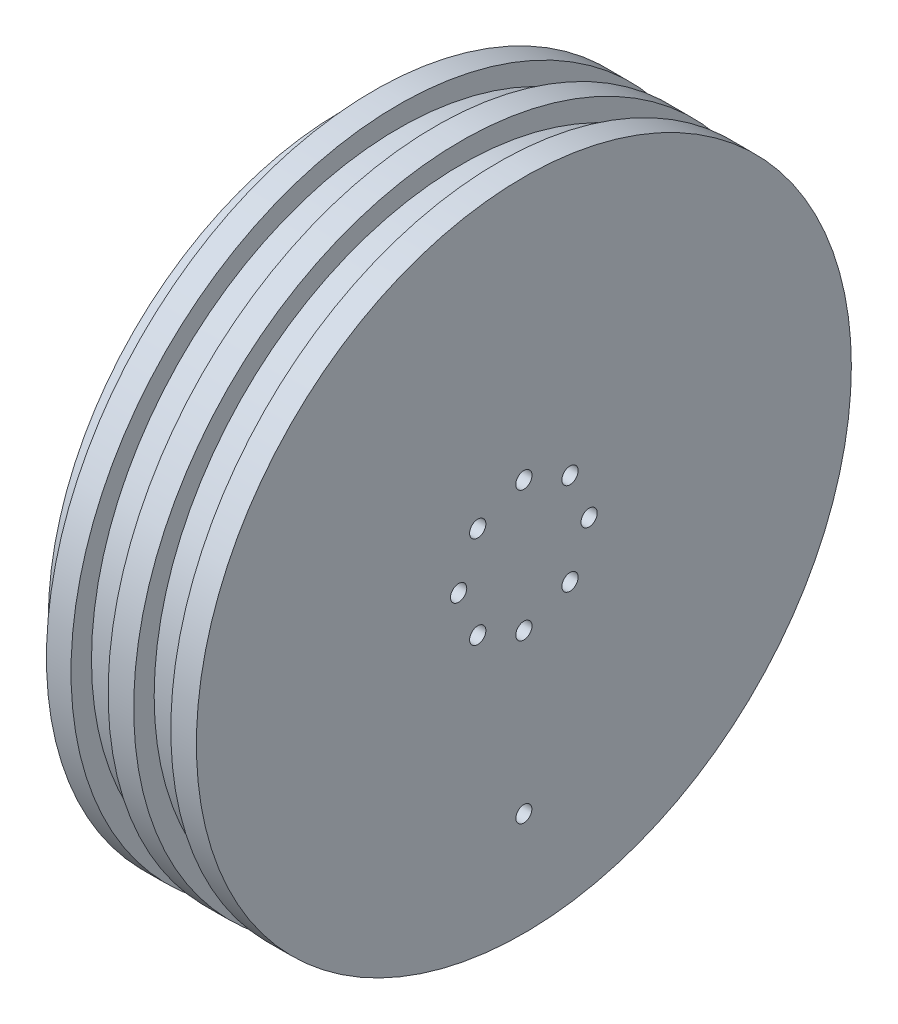
ISO-10303-21;
HEADER;
FILE_DESCRIPTION(('STEP AP214'),'2;1');
FILE_NAME('part.step','',(''),(''),'','','');
FILE_SCHEMA(('AUTOMOTIVE_DESIGN { 1 0 10303 214 1 1 1 1 }'));
ENDSEC;
DATA;
#1=APPLICATION_CONTEXT('core data for automotive mechanical design processes');
#2=APPLICATION_PROTOCOL_DEFINITION('international standard','automotive_design',2000,#1);
#3=PRODUCT_CONTEXT('',#1,'mechanical');
#4=PRODUCT('Part','Part','',(#3));
#5=PRODUCT_RELATED_PRODUCT_CATEGORY('part','',(#4));
#6=PRODUCT_DEFINITION_FORMATION('','',#4);
#7=PRODUCT_DEFINITION_CONTEXT('part definition',#1,'design');
#8=PRODUCT_DEFINITION('design','',#6,#7);
#9=PRODUCT_DEFINITION_SHAPE('','',#8);
#10=(LENGTH_UNIT() NAMED_UNIT(*) SI_UNIT(.MILLI.,.METRE.));
#11=(NAMED_UNIT(*) PLANE_ANGLE_UNIT() SI_UNIT($,.RADIAN.));
#12=(NAMED_UNIT(*) SI_UNIT($,.STERADIAN.) SOLID_ANGLE_UNIT());
#13=UNCERTAINTY_MEASURE_WITH_UNIT(LENGTH_MEASURE(1.E-05),#10,'distance_accuracy_value','');
#14=(GEOMETRIC_REPRESENTATION_CONTEXT(3) GLOBAL_UNCERTAINTY_ASSIGNED_CONTEXT((#13)) GLOBAL_UNIT_ASSIGNED_CONTEXT((#10,
#11,#12)) REPRESENTATION_CONTEXT('',''));
#15=CARTESIAN_POINT('',(0.,0.,0.));
#16=DIRECTION('',(0.,0.,1.));
#17=DIRECTION('',(1.,0.,0.));
#18=AXIS2_PLACEMENT_3D('',#15,#16,#17);
#19=CARTESIAN_POINT('',(-14.885,0.,0.));
#20=DIRECTION('',(-1.,0.,0.));
#21=DIRECTION('',(0.,0.,1.));
#22=AXIS2_PLACEMENT_3D('',#19,#20,#21);
#23=PLANE('',#22);
#24=CARTESIAN_POINT('',(-14.885,0.,0.));
#25=DIRECTION('',(1.,0.,0.));
#26=DIRECTION('',(0.,0.,-1.));
#27=AXIS2_PLACEMENT_3D('',#24,#25,#26);
#28=CIRCLE('',#27,29.1592);
#29=CARTESIAN_POINT('',(-14.885,0.,-29.1592));
#30=VERTEX_POINT('',#29);
#31=EDGE_CURVE('E11',#30,#30,#28,.T.);
#32=ORIENTED_EDGE('',*,*,#31,.T.);
#33=EDGE_LOOP('',(#32));
#34=FACE_BOUND('',#33,.T.);
#35=CARTESIAN_POINT('',(-14.885,0.,0.));
#36=DIRECTION('',(1.,0.,0.));
#37=DIRECTION('',(0.,0.,-1.));
#38=AXIS2_PLACEMENT_3D('',#35,#36,#37);
#39=CIRCLE('',#38,32.512);
#40=CARTESIAN_POINT('',(-14.885,0.,-32.512));
#41=VERTEX_POINT('',#40);
#42=EDGE_CURVE('E92',#41,#41,#39,.T.);
#43=ORIENTED_EDGE('',*,*,#42,.F.);
#44=EDGE_LOOP('',(#43));
#45=FACE_BOUND('',#44,.T.);
#46=ADVANCED_FACE('F36',(#34,#45),#23,.T.);
#47=CARTESIAN_POINT('',(17.7798798469095,0.,0.));
#48=DIRECTION('',(1.,0.,0.));
#49=DIRECTION('',(0.,0.,-1.));
#50=AXIS2_PLACEMENT_3D('',#47,#48,#49);
#51=CYLINDRICAL_SURFACE('',#50,29.1592);
#52=CARTESIAN_POINT('',(-18.06,0.,0.));
#53=DIRECTION('',(1.,0.,0.));
#54=DIRECTION('',(0.,0.,-1.));
#55=AXIS2_PLACEMENT_3D('',#52,#53,#54);
#56=CIRCLE('',#55,29.1592);
#57=CARTESIAN_POINT('',(-18.06,0.,-29.1592));
#58=VERTEX_POINT('',#57);
#59=EDGE_CURVE('E44',#58,#58,#56,.T.);
#60=ORIENTED_EDGE('',*,*,#59,.T.);
#61=EDGE_LOOP('',(#60));
#62=FACE_BOUND('',#61,.T.);
#63=ORIENTED_EDGE('',*,*,#31,.F.);
#64=EDGE_LOOP('',(#63));
#65=FACE_BOUND('',#64,.T.);
#66=ADVANCED_FACE('F125',(#62,#65),#51,.T.);
#67=CARTESIAN_POINT('',(-18.06,0.,0.));
#68=DIRECTION('',(-1.,0.,0.));
#69=DIRECTION('',(0.,0.,1.));
#70=AXIS2_PLACEMENT_3D('',#67,#68,#69);
#71=PLANE('',#70);
#72=CARTESIAN_POINT('',(-18.06,-22.225,-1.49186218934006E-13));
#73=DIRECTION('',(-1.,0.,0.));
#74=DIRECTION('',(0.,0.,1.));
#75=AXIS2_PLACEMENT_3D('',#72,#73,#74);
#76=CIRCLE('',#75,4.21639999999999);
#77=CARTESIAN_POINT('',(-18.06,-22.225,4.21639999999984));
#78=VERTEX_POINT('',#77);
#79=EDGE_CURVE('E279',#78,#78,#76,.T.);
#80=ORIENTED_EDGE('',*,*,#79,.F.);
#81=EDGE_LOOP('',(#80));
#82=FACE_BOUND('',#81,.T.);
#83=CARTESIAN_POINT('',(-18.06,6.477,0.));
#84=DIRECTION('',(-1.,0.,0.));
#85=DIRECTION('',(0.,0.,1.));
#86=AXIS2_PLACEMENT_3D('',#83,#84,#85);
#87=CIRCLE('',#86,0.80645);
#88=CARTESIAN_POINT('',(-18.06,6.477,0.80645));
#89=VERTEX_POINT('',#88);
#90=EDGE_CURVE('E74',#89,#89,#87,.F.);
#91=ORIENTED_EDGE('',*,*,#90,.T.);
#92=EDGE_LOOP('',(#91));
#93=FACE_BOUND('',#92,.T.);
#94=CARTESIAN_POINT('',(-18.06,4.57993062174527,-4.57993062174527));
#95=DIRECTION('',(-1.,0.,0.));
#96=DIRECTION('',(0.,0.,1.));
#97=AXIS2_PLACEMENT_3D('',#94,#95,#96);
#98=CIRCLE('',#97,0.80645);
#99=CARTESIAN_POINT('',(-18.06,4.57993062174527,-3.77348062174527));
#100=VERTEX_POINT('',#99);
#101=EDGE_CURVE('E290',#100,#100,#98,.F.);
#102=ORIENTED_EDGE('',*,*,#101,.T.);
#103=EDGE_LOOP('',(#102));
#104=FACE_BOUND('',#103,.T.);
#105=CARTESIAN_POINT('',(-18.06,0.,-6.477));
#106=DIRECTION('',(-1.,0.,0.));
#107=DIRECTION('',(0.,0.,1.));
#108=AXIS2_PLACEMENT_3D('',#105,#106,#107);
#109=CIRCLE('',#108,0.80645);
#110=CARTESIAN_POINT('',(-18.06,0.,-5.67055));
#111=VERTEX_POINT('',#110);
#112=EDGE_CURVE('E296',#111,#111,#109,.F.);
#113=ORIENTED_EDGE('',*,*,#112,.T.);
#114=EDGE_LOOP('',(#113));
#115=FACE_BOUND('',#114,.T.);
#116=CARTESIAN_POINT('',(-18.06,-4.57993062174527,-4.57993062174527));
#117=DIRECTION('',(-1.,0.,0.));
#118=DIRECTION('',(0.,0.,1.));
#119=AXIS2_PLACEMENT_3D('',#116,#117,#118);
#120=CIRCLE('',#119,0.80645);
#121=CARTESIAN_POINT('',(-18.06,-4.57993062174527,-3.77348062174527));
#122=VERTEX_POINT('',#121);
#123=EDGE_CURVE('E302',#122,#122,#120,.F.);
#124=ORIENTED_EDGE('',*,*,#123,.T.);
#125=EDGE_LOOP('',(#124));
#126=FACE_BOUND('',#125,.T.);
#127=CARTESIAN_POINT('',(-18.06,-6.477,0.));
#128=DIRECTION('',(-1.,0.,0.));
#129=DIRECTION('',(0.,0.,1.));
#130=AXIS2_PLACEMENT_3D('',#127,#128,#129);
#131=CIRCLE('',#130,0.80645);
#132=CARTESIAN_POINT('',(-18.06,-6.477,0.806449999999999));
#133=VERTEX_POINT('',#132);
#134=EDGE_CURVE('E308',#133,#133,#131,.F.);
#135=ORIENTED_EDGE('',*,*,#134,.T.);
#136=EDGE_LOOP('',(#135));
#137=FACE_BOUND('',#136,.T.);
#138=CARTESIAN_POINT('',(-18.06,-4.57993062174527,4.57993062174527));
#139=DIRECTION('',(-1.,0.,0.));
#140=DIRECTION('',(0.,0.,1.));
#141=AXIS2_PLACEMENT_3D('',#138,#139,#140);
#142=CIRCLE('',#141,0.80645);
#143=CARTESIAN_POINT('',(-18.06,-4.57993062174527,5.38638062174527));
#144=VERTEX_POINT('',#143);
#145=EDGE_CURVE('E314',#144,#144,#142,.F.);
#146=ORIENTED_EDGE('',*,*,#145,.T.);
#147=EDGE_LOOP('',(#146));
#148=FACE_BOUND('',#147,.T.);
#149=CARTESIAN_POINT('',(-18.06,0.,6.477));
#150=DIRECTION('',(-1.,0.,0.));
#151=DIRECTION('',(0.,0.,1.));
#152=AXIS2_PLACEMENT_3D('',#149,#150,#151);
#153=CIRCLE('',#152,0.80645);
#154=CARTESIAN_POINT('',(-18.06,0.,7.28345));
#155=VERTEX_POINT('',#154);
#156=EDGE_CURVE('E320',#155,#155,#153,.F.);
#157=ORIENTED_EDGE('',*,*,#156,.T.);
#158=EDGE_LOOP('',(#157));
#159=FACE_BOUND('',#158,.T.);
#160=CARTESIAN_POINT('',(-18.06,4.57993062174527,4.57993062174527));
#161=DIRECTION('',(-1.,0.,0.));
#162=DIRECTION('',(0.,0.,1.));
#163=AXIS2_PLACEMENT_3D('',#160,#161,#162);
#164=CIRCLE('',#163,0.80645);
#165=CARTESIAN_POINT('',(-18.06,4.57993062174527,5.38638062174527));
#166=VERTEX_POINT('',#165);
#167=EDGE_CURVE('E326',#166,#166,#164,.F.);
#168=ORIENTED_EDGE('',*,*,#167,.T.);
#169=EDGE_LOOP('',(#168));
#170=FACE_BOUND('',#169,.T.);
#171=CARTESIAN_POINT('',(-18.06,10.31875,17.8725992706014));
#172=DIRECTION('',(-1.,0.,0.));
#173=DIRECTION('',(0.,0.,1.));
#174=AXIS2_PLACEMENT_3D('',#171,#172,#173);
#175=CIRCLE('',#174,0.888999999999989);
#176=CARTESIAN_POINT('',(-18.06,10.31875,18.7615992706014));
#177=VERTEX_POINT('',#176);
#178=EDGE_CURVE('E68',#177,#177,#175,.T.);
#179=ORIENTED_EDGE('',*,*,#178,.F.);
#180=EDGE_LOOP('',(#179));
#181=FACE_BOUND('',#180,.T.);
#182=CARTESIAN_POINT('',(-18.06,-10.3187499999998,-17.8725992706014));
#183=DIRECTION('',(-1.,0.,0.));
#184=DIRECTION('',(0.,0.,1.));
#185=AXIS2_PLACEMENT_3D('',#182,#183,#184);
#186=CIRCLE('',#185,2.0447);
#187=CARTESIAN_POINT('',(-18.06,-10.3187499999998,-15.8278992706015));
#188=VERTEX_POINT('',#187);
#189=EDGE_CURVE('E67',#188,#188,#186,.T.);
#190=ORIENTED_EDGE('',*,*,#189,.F.);
#191=EDGE_LOOP('',(#190));
#192=FACE_BOUND('',#191,.T.);
#193=CARTESIAN_POINT('',(-18.06,-10.3187500000001,17.8725992706013));
#194=DIRECTION('',(-1.,0.,0.));
#195=DIRECTION('',(0.,0.,1.));
#196=AXIS2_PLACEMENT_3D('',#193,#194,#195);
#197=CIRCLE('',#196,2.0447);
#198=CARTESIAN_POINT('',(-18.06,-10.3187500000001,19.9172992706013));
#199=VERTEX_POINT('',#198);
#200=EDGE_CURVE('E80',#199,#199,#197,.T.);
#201=ORIENTED_EDGE('',*,*,#200,.F.);
#202=EDGE_LOOP('',(#201));
#203=FACE_BOUND('',#202,.T.);
#204=CARTESIAN_POINT('',(-18.06,20.6375,0.));
#205=DIRECTION('',(-1.,0.,0.));
#206=DIRECTION('',(0.,0.,1.));
#207=AXIS2_PLACEMENT_3D('',#204,#205,#206);
#208=CIRCLE('',#207,2.0447);
#209=CARTESIAN_POINT('',(-18.06,20.6375,2.0447));
#210=VERTEX_POINT('',#209);
#211=EDGE_CURVE('E86',#210,#210,#208,.T.);
#212=ORIENTED_EDGE('',*,*,#211,.F.);
#213=EDGE_LOOP('',(#212));
#214=FACE_BOUND('',#213,.T.);
#215=ORIENTED_EDGE('',*,*,#59,.F.);
#216=EDGE_LOOP('',(#215));
#217=FACE_BOUND('',#216,.T.);
#218=ADVANCED_FACE('F128',(#82,#93,#104,#115,#126,#137,#148,#159,#170,#181,#192,#203,#214,#217),
#71,.T.);
#219=CARTESIAN_POINT('',(0.,0.,0.));
#220=DIRECTION('',(1.,0.,0.));
#221=DIRECTION('',(0.,0.,-1.));
#222=AXIS2_PLACEMENT_3D('',#219,#220,#221);
#223=PLANE('',#222);
#224=CARTESIAN_POINT('',(0.,-22.225,-1.49186218934006E-13));
#225=DIRECTION('',(1.,0.,0.));
#226=DIRECTION('',(0.,0.,-1.));
#227=AXIS2_PLACEMENT_3D('',#224,#225,#226);
#228=CIRCLE('',#227,0.793749999999999);
#229=CARTESIAN_POINT('',(0.,-22.225,-0.793750000000149));
#230=VERTEX_POINT('',#229);
#231=EDGE_CURVE('E283',#230,#230,#228,.T.);
#232=ORIENTED_EDGE('',*,*,#231,.F.);
#233=EDGE_LOOP('',(#232));
#234=FACE_BOUND('',#233,.T.);
#235=CARTESIAN_POINT('',(0.,6.477,0.));
#236=DIRECTION('',(1.,0.,0.));
#237=DIRECTION('',(0.,0.,-1.));
#238=AXIS2_PLACEMENT_3D('',#235,#236,#237);
#239=CIRCLE('',#238,0.80645);
#240=CARTESIAN_POINT('',(0.,6.477,-0.80645));
#241=VERTEX_POINT('',#240);
#242=EDGE_CURVE('E287',#241,#241,#239,.T.);
#243=ORIENTED_EDGE('',*,*,#242,.F.);
#244=EDGE_LOOP('',(#243));
#245=FACE_BOUND('',#244,.T.);
#246=CARTESIAN_POINT('',(0.,4.57993062174527,-4.57993062174527));
#247=DIRECTION('',(1.,0.,0.));
#248=DIRECTION('',(0.,0.,-1.));
#249=AXIS2_PLACEMENT_3D('',#246,#247,#248);
#250=CIRCLE('',#249,0.80645);
#251=CARTESIAN_POINT('',(0.,4.57993062174527,-5.38638062174527));
#252=VERTEX_POINT('',#251);
#253=EDGE_CURVE('E293',#252,#252,#250,.T.);
#254=ORIENTED_EDGE('',*,*,#253,.F.);
#255=EDGE_LOOP('',(#254));
#256=FACE_BOUND('',#255,.T.);
#257=CARTESIAN_POINT('',(0.,0.,-6.477));
#258=DIRECTION('',(1.,0.,0.));
#259=DIRECTION('',(0.,0.,-1.));
#260=AXIS2_PLACEMENT_3D('',#257,#258,#259);
#261=CIRCLE('',#260,0.80645);
#262=CARTESIAN_POINT('',(0.,0.,-7.28345));
#263=VERTEX_POINT('',#262);
#264=EDGE_CURVE('E299',#263,#263,#261,.T.);
#265=ORIENTED_EDGE('',*,*,#264,.F.);
#266=EDGE_LOOP('',(#265));
#267=FACE_BOUND('',#266,.T.);
#268=CARTESIAN_POINT('',(0.,-4.57993062174527,-4.57993062174527));
#269=DIRECTION('',(1.,0.,0.));
#270=DIRECTION('',(0.,0.,-1.));
#271=AXIS2_PLACEMENT_3D('',#268,#269,#270);
#272=CIRCLE('',#271,0.80645);
#273=CARTESIAN_POINT('',(0.,-4.57993062174527,-5.38638062174527));
#274=VERTEX_POINT('',#273);
#275=EDGE_CURVE('E305',#274,#274,#272,.T.);
#276=ORIENTED_EDGE('',*,*,#275,.F.);
#277=EDGE_LOOP('',(#276));
#278=FACE_BOUND('',#277,.T.);
#279=CARTESIAN_POINT('',(0.,-6.477,0.));
#280=DIRECTION('',(1.,0.,0.));
#281=DIRECTION('',(0.,0.,-1.));
#282=AXIS2_PLACEMENT_3D('',#279,#280,#281);
#283=CIRCLE('',#282,0.80645);
#284=CARTESIAN_POINT('',(0.,-6.477,-0.806450000000001));
#285=VERTEX_POINT('',#284);
#286=EDGE_CURVE('E311',#285,#285,#283,.T.);
#287=ORIENTED_EDGE('',*,*,#286,.F.);
#288=EDGE_LOOP('',(#287));
#289=FACE_BOUND('',#288,.T.);
#290=CARTESIAN_POINT('',(0.,-4.57993062174527,4.57993062174527));
#291=DIRECTION('',(1.,0.,0.));
#292=DIRECTION('',(0.,0.,-1.));
#293=AXIS2_PLACEMENT_3D('',#290,#291,#292);
#294=CIRCLE('',#293,0.80645);
#295=CARTESIAN_POINT('',(0.,-4.57993062174527,3.77348062174527));
#296=VERTEX_POINT('',#295);
#297=EDGE_CURVE('E317',#296,#296,#294,.T.);
#298=ORIENTED_EDGE('',*,*,#297,.F.);
#299=EDGE_LOOP('',(#298));
#300=FACE_BOUND('',#299,.T.);
#301=CARTESIAN_POINT('',(0.,0.,6.477));
#302=DIRECTION('',(1.,0.,0.));
#303=DIRECTION('',(0.,0.,-1.));
#304=AXIS2_PLACEMENT_3D('',#301,#302,#303);
#305=CIRCLE('',#304,0.80645);
#306=CARTESIAN_POINT('',(0.,0.,5.67055));
#307=VERTEX_POINT('',#306);
#308=EDGE_CURVE('E323',#307,#307,#305,.T.);
#309=ORIENTED_EDGE('',*,*,#308,.F.);
#310=EDGE_LOOP('',(#309));
#311=FACE_BOUND('',#310,.T.);
#312=CARTESIAN_POINT('',(0.,4.57993062174527,4.57993062174527));
#313=DIRECTION('',(1.,0.,0.));
#314=DIRECTION('',(0.,0.,-1.));
#315=AXIS2_PLACEMENT_3D('',#312,#313,#314);
#316=CIRCLE('',#315,0.80645);
#317=CARTESIAN_POINT('',(0.,4.57993062174527,3.77348062174527));
#318=VERTEX_POINT('',#317);
#319=EDGE_CURVE('E286',#318,#318,#316,.T.);
#320=ORIENTED_EDGE('',*,*,#319,.F.);
#321=EDGE_LOOP('',(#320));
#322=FACE_BOUND('',#321,.T.);
#323=CARTESIAN_POINT('',(0.,0.,0.));
#324=DIRECTION('',(1.,0.,0.));
#325=DIRECTION('',(0.,0.,-1.));
#326=AXIS2_PLACEMENT_3D('',#323,#324,#325);
#327=CIRCLE('',#326,32.512);
#328=CARTESIAN_POINT('',(0.,0.,-32.512));
#329=VERTEX_POINT('',#328);
#330=EDGE_CURVE('E119',#329,#329,#327,.T.);
#331=ORIENTED_EDGE('',*,*,#330,.T.);
#332=EDGE_LOOP('',(#331));
#333=FACE_BOUND('',#332,.T.);
#334=ADVANCED_FACE('F130',(#234,#245,#256,#267,#278,#289,#300,#311,#322,#333),#223,.T.);
#335=CARTESIAN_POINT('',(17.7798798469095,0.,0.));
#336=DIRECTION('',(1.,0.,0.));
#337=DIRECTION('',(0.,0.,-1.));
#338=AXIS2_PLACEMENT_3D('',#335,#336,#337);
#339=CYLINDRICAL_SURFACE('',#338,32.512);
#340=CARTESIAN_POINT('',(-2.53999999999999,0.,0.));
#341=DIRECTION('',(1.,0.,0.));
#342=DIRECTION('',(0.,0.,-1.));
#343=AXIS2_PLACEMENT_3D('',#340,#341,#342);
#344=CIRCLE('',#343,32.512);
#345=CARTESIAN_POINT('',(-2.53999999999999,0.,-32.512));
#346=VERTEX_POINT('',#345);
#347=EDGE_CURVE('E116',#346,#346,#344,.T.);
#348=ORIENTED_EDGE('',*,*,#347,.T.);
#349=EDGE_LOOP('',(#348));
#350=FACE_BOUND('',#349,.T.);
#351=ORIENTED_EDGE('',*,*,#330,.F.);
#352=EDGE_LOOP('',(#351));
#353=FACE_BOUND('',#352,.T.);
#354=ADVANCED_FACE('F137',(#350,#353),#339,.T.);
#355=CARTESIAN_POINT('',(-2.53999999999999,0.,0.));
#356=DIRECTION('',(-1.,0.,0.));
#357=DIRECTION('',(0.,0.,1.));
#358=AXIS2_PLACEMENT_3D('',#355,#356,#357);
#359=PLANE('',#358);
#360=CARTESIAN_POINT('',(-2.53999999999999,0.,0.));
#361=DIRECTION('',(1.,0.,0.));
#362=DIRECTION('',(0.,0.,-1.));
#363=AXIS2_PLACEMENT_3D('',#360,#361,#362);
#364=CIRCLE('',#363,30.48);
#365=CARTESIAN_POINT('',(-2.53999999999999,0.,-30.48));
#366=VERTEX_POINT('',#365);
#367=EDGE_CURVE('E113',#366,#366,#364,.T.);
#368=ORIENTED_EDGE('',*,*,#367,.T.);
#369=EDGE_LOOP('',(#368));
#370=FACE_BOUND('',#369,.T.);
#371=ORIENTED_EDGE('',*,*,#347,.F.);
#372=EDGE_LOOP('',(#371));
#373=FACE_BOUND('',#372,.T.);
#374=ADVANCED_FACE('F190',(#370,#373),#359,.T.);
#375=CARTESIAN_POINT('',(17.7798798469095,0.,0.));
#376=DIRECTION('',(1.,0.,0.));
#377=DIRECTION('',(0.,0.,-1.));
#378=AXIS2_PLACEMENT_3D('',#375,#376,#377);
#379=CYLINDRICAL_SURFACE('',#378,30.48);
#380=CARTESIAN_POINT('',(-6.22299999999999,0.,0.));
#381=DIRECTION('',(1.,0.,0.));
#382=DIRECTION('',(0.,0.,-1.));
#383=AXIS2_PLACEMENT_3D('',#380,#381,#382);
#384=CIRCLE('',#383,30.48);
#385=CARTESIAN_POINT('',(-6.22299999999999,0.,-30.48));
#386=VERTEX_POINT('',#385);
#387=EDGE_CURVE('E110',#386,#386,#384,.T.);
#388=ORIENTED_EDGE('',*,*,#387,.T.);
#389=EDGE_LOOP('',(#388));
#390=FACE_BOUND('',#389,.T.);
#391=ORIENTED_EDGE('',*,*,#367,.F.);
#392=EDGE_LOOP('',(#391));
#393=FACE_BOUND('',#392,.T.);
#394=ADVANCED_FACE('F184',(#390,#393),#379,.T.);
#395=CARTESIAN_POINT('',(-6.22299999999999,0.,0.));
#396=DIRECTION('',(1.,0.,0.));
#397=DIRECTION('',(0.,0.,-1.));
#398=AXIS2_PLACEMENT_3D('',#395,#396,#397);
#399=PLANE('',#398);
#400=CARTESIAN_POINT('',(-6.22299999999999,0.,0.));
#401=DIRECTION('',(1.,0.,0.));
#402=DIRECTION('',(0.,0.,-1.));
#403=AXIS2_PLACEMENT_3D('',#400,#401,#402);
#404=CIRCLE('',#403,32.512);
#405=CARTESIAN_POINT('',(-6.22299999999999,0.,-32.512));
#406=VERTEX_POINT('',#405);
#407=EDGE_CURVE('E107',#406,#406,#404,.T.);
#408=ORIENTED_EDGE('',*,*,#407,.T.);
#409=EDGE_LOOP('',(#408));
#410=FACE_BOUND('',#409,.T.);
#411=ORIENTED_EDGE('',*,*,#387,.F.);
#412=EDGE_LOOP('',(#411));
#413=FACE_BOUND('',#412,.T.);
#414=ADVANCED_FACE('F178',(#410,#413),#399,.T.);
#415=CARTESIAN_POINT('',(17.7798798469095,0.,0.));
#416=DIRECTION('',(1.,0.,0.));
#417=DIRECTION('',(0.,0.,-1.));
#418=AXIS2_PLACEMENT_3D('',#415,#416,#417);
#419=CYLINDRICAL_SURFACE('',#418,32.512);
#420=CARTESIAN_POINT('',(-8.76299999999999,0.,0.));
#421=DIRECTION('',(1.,0.,0.));
#422=DIRECTION('',(0.,0.,-1.));
#423=AXIS2_PLACEMENT_3D('',#420,#421,#422);
#424=CIRCLE('',#423,32.512);
#425=CARTESIAN_POINT('',(-8.76299999999999,0.,-32.512));
#426=VERTEX_POINT('',#425);
#427=EDGE_CURVE('E104',#426,#426,#424,.T.);
#428=ORIENTED_EDGE('',*,*,#427,.T.);
#429=EDGE_LOOP('',(#428));
#430=FACE_BOUND('',#429,.T.);
#431=ORIENTED_EDGE('',*,*,#407,.F.);
#432=EDGE_LOOP('',(#431));
#433=FACE_BOUND('',#432,.T.);
#434=ADVANCED_FACE('F172',(#430,#433),#419,.T.);
#435=CARTESIAN_POINT('',(-8.76299999999999,0.,0.));
#436=DIRECTION('',(-1.,0.,0.));
#437=DIRECTION('',(0.,0.,1.));
#438=AXIS2_PLACEMENT_3D('',#435,#436,#437);
#439=PLANE('',#438);
#440=CARTESIAN_POINT('',(-8.76299999999999,0.,0.));
#441=DIRECTION('',(1.,0.,0.));
#442=DIRECTION('',(0.,0.,-1.));
#443=AXIS2_PLACEMENT_3D('',#440,#441,#442);
#444=CIRCLE('',#443,30.48);
#445=CARTESIAN_POINT('',(-8.76299999999999,0.,-30.48));
#446=VERTEX_POINT('',#445);
#447=EDGE_CURVE('E101',#446,#446,#444,.T.);
#448=ORIENTED_EDGE('',*,*,#447,.T.);
#449=EDGE_LOOP('',(#448));
#450=FACE_BOUND('',#449,.T.);
#451=ORIENTED_EDGE('',*,*,#427,.F.);
#452=EDGE_LOOP('',(#451));
#453=FACE_BOUND('',#452,.T.);
#454=ADVANCED_FACE('F166',(#450,#453),#439,.T.);
#455=CARTESIAN_POINT('',(17.7798798469095,0.,0.));
#456=DIRECTION('',(1.,0.,0.));
#457=DIRECTION('',(0.,0.,-1.));
#458=AXIS2_PLACEMENT_3D('',#455,#456,#457);
#459=CYLINDRICAL_SURFACE('',#458,30.48);
#460=CARTESIAN_POINT('',(-12.446,0.,0.));
#461=DIRECTION('',(1.,0.,0.));
#462=DIRECTION('',(0.,0.,-1.));
#463=AXIS2_PLACEMENT_3D('',#460,#461,#462);
#464=CIRCLE('',#463,30.48);
#465=CARTESIAN_POINT('',(-12.446,0.,-30.48));
#466=VERTEX_POINT('',#465);
#467=EDGE_CURVE('E98',#466,#466,#464,.T.);
#468=ORIENTED_EDGE('',*,*,#467,.T.);
#469=EDGE_LOOP('',(#468));
#470=FACE_BOUND('',#469,.T.);
#471=ORIENTED_EDGE('',*,*,#447,.F.);
#472=EDGE_LOOP('',(#471));
#473=FACE_BOUND('',#472,.T.);
#474=ADVANCED_FACE('F160',(#470,#473),#459,.T.);
#475=CARTESIAN_POINT('',(-12.446,0.,0.));
#476=DIRECTION('',(1.,0.,0.));
#477=DIRECTION('',(0.,0.,-1.));
#478=AXIS2_PLACEMENT_3D('',#475,#476,#477);
#479=PLANE('',#478);
#480=CARTESIAN_POINT('',(-12.446,0.,0.));
#481=DIRECTION('',(1.,0.,0.));
#482=DIRECTION('',(0.,0.,-1.));
#483=AXIS2_PLACEMENT_3D('',#480,#481,#482);
#484=CIRCLE('',#483,32.512);
#485=CARTESIAN_POINT('',(-12.446,0.,-32.512));
#486=VERTEX_POINT('',#485);
#487=EDGE_CURVE('E95',#486,#486,#484,.T.);
#488=ORIENTED_EDGE('',*,*,#487,.T.);
#489=EDGE_LOOP('',(#488));
#490=FACE_BOUND('',#489,.T.);
#491=ORIENTED_EDGE('',*,*,#467,.F.);
#492=EDGE_LOOP('',(#491));
#493=FACE_BOUND('',#492,.T.);
#494=ADVANCED_FACE('F154',(#490,#493),#479,.T.);
#495=CARTESIAN_POINT('',(17.7798798469095,0.,0.));
#496=DIRECTION('',(1.,0.,0.));
#497=DIRECTION('',(0.,0.,-1.));
#498=AXIS2_PLACEMENT_3D('',#495,#496,#497);
#499=CYLINDRICAL_SURFACE('',#498,32.512);
#500=ORIENTED_EDGE('',*,*,#42,.T.);
#501=EDGE_LOOP('',(#500));
#502=FACE_BOUND('',#501,.T.);
#503=ORIENTED_EDGE('',*,*,#487,.F.);
#504=EDGE_LOOP('',(#503));
#505=FACE_BOUND('',#504,.T.);
#506=ADVANCED_FACE('F150',(#502,#505),#499,.T.);
#507=CARTESIAN_POINT('',(-8.408,20.6375,0.));
#508=DIRECTION('',(-1.,0.,0.));
#509=DIRECTION('',(0.,0.,1.));
#510=AXIS2_PLACEMENT_3D('',#507,#508,#509);
#511=CONICAL_SURFACE('',#510,2.0447,1.02974425867665);
#512=CARTESIAN_POINT('',(-7.17942029227434,20.6375,0.));
#513=VERTEX_POINT('',#512);
#514=VERTEX_LOOP('',#513);
#515=FACE_BOUND('',#514,.T.);
#516=CARTESIAN_POINT('',(-8.408,20.6375,0.));
#517=DIRECTION('',(-1.,0.,0.));
#518=DIRECTION('',(0.,0.,1.));
#519=AXIS2_PLACEMENT_3D('',#516,#517,#518);
#520=CIRCLE('',#519,2.0447);
#521=CARTESIAN_POINT('',(-8.408,20.6375,2.0447));
#522=VERTEX_POINT('',#521);
#523=EDGE_CURVE('E89',#522,#522,#520,.T.);
#524=ORIENTED_EDGE('',*,*,#523,.T.);
#525=EDGE_LOOP('',(#524));
#526=FACE_BOUND('',#525,.T.);
#527=ADVANCED_FACE('F153',(#515,#526),#511,.F.);
#528=CARTESIAN_POINT('',(-18.06,20.6375,0.));
#529=DIRECTION('',(-1.,0.,0.));
#530=DIRECTION('',(0.,0.,1.));
#531=AXIS2_PLACEMENT_3D('',#528,#529,#530);
#532=CYLINDRICAL_SURFACE('',#531,2.0447);
#533=ORIENTED_EDGE('',*,*,#523,.F.);
#534=EDGE_LOOP('',(#533));
#535=FACE_BOUND('',#534,.T.);
#536=ORIENTED_EDGE('',*,*,#211,.T.);
#537=EDGE_LOOP('',(#536));
#538=FACE_BOUND('',#537,.T.);
#539=ADVANCED_FACE('F209',(#535,#538),#532,.F.);
#540=CARTESIAN_POINT('',(-8.408,-10.3187500000001,17.8725992706013));
#541=DIRECTION('',(-1.,0.,0.));
#542=DIRECTION('',(0.,0.,1.));
#543=AXIS2_PLACEMENT_3D('',#540,#541,#542);
#544=CONICAL_SURFACE('',#543,2.0447,1.02974425867665);
#545=CARTESIAN_POINT('',(-7.17942029227434,-10.3187500000001,17.8725992706013));
#546=VERTEX_POINT('',#545);
#547=VERTEX_LOOP('',#546);
#548=FACE_BOUND('',#547,.T.);
#549=CARTESIAN_POINT('',(-8.408,-10.3187500000001,17.8725992706013));
#550=DIRECTION('',(-1.,0.,0.));
#551=DIRECTION('',(0.,0.,1.));
#552=AXIS2_PLACEMENT_3D('',#549,#550,#551);
#553=CIRCLE('',#552,2.0447);
#554=CARTESIAN_POINT('',(-8.408,-10.3187500000001,19.9172992706013));
#555=VERTEX_POINT('',#554);
#556=EDGE_CURVE('E83',#555,#555,#553,.T.);
#557=ORIENTED_EDGE('',*,*,#556,.T.);
#558=EDGE_LOOP('',(#557));
#559=FACE_BOUND('',#558,.T.);
#560=ADVANCED_FACE('F212',(#548,#559),#544,.F.);
#561=CARTESIAN_POINT('',(-18.06,-10.3187500000001,17.8725992706013));
#562=DIRECTION('',(-1.,0.,0.));
#563=DIRECTION('',(0.,0.,1.));
#564=AXIS2_PLACEMENT_3D('',#561,#562,#563);
#565=CYLINDRICAL_SURFACE('',#564,2.0447);
#566=ORIENTED_EDGE('',*,*,#556,.F.);
#567=EDGE_LOOP('',(#566));
#568=FACE_BOUND('',#567,.T.);
#569=ORIENTED_EDGE('',*,*,#200,.T.);
#570=EDGE_LOOP('',(#569));
#571=FACE_BOUND('',#570,.T.);
#572=ADVANCED_FACE('F216',(#568,#571),#565,.F.);
#573=CARTESIAN_POINT('',(-8.408,-10.3187499999998,-17.8725992706014));
#574=DIRECTION('',(-1.,0.,0.));
#575=DIRECTION('',(0.,0.,1.));
#576=AXIS2_PLACEMENT_3D('',#573,#574,#575);
#577=CONICAL_SURFACE('',#576,2.0447,1.02974425867665);
#578=CARTESIAN_POINT('',(-7.17942029227434,-10.3187499999998,-17.8725992706014));
#579=VERTEX_POINT('',#578);
#580=VERTEX_LOOP('',#579);
#581=FACE_BOUND('',#580,.T.);
#582=CARTESIAN_POINT('',(-8.408,-10.3187499999998,-17.8725992706014));
#583=DIRECTION('',(-1.,0.,0.));
#584=DIRECTION('',(0.,0.,1.));
#585=AXIS2_PLACEMENT_3D('',#582,#583,#584);
#586=CIRCLE('',#585,2.0447);
#587=CARTESIAN_POINT('',(-8.408,-10.3187499999998,-15.8278992706015));
#588=VERTEX_POINT('',#587);
#589=EDGE_CURVE('E71',#588,#588,#586,.T.);
#590=ORIENTED_EDGE('',*,*,#589,.T.);
#591=EDGE_LOOP('',(#590));
#592=FACE_BOUND('',#591,.T.);
#593=ADVANCED_FACE('F219',(#581,#592),#577,.F.);
#594=CARTESIAN_POINT('',(-18.06,-10.3187499999998,-17.8725992706014));
#595=DIRECTION('',(-1.,0.,0.));
#596=DIRECTION('',(0.,0.,1.));
#597=AXIS2_PLACEMENT_3D('',#594,#595,#596);
#598=CYLINDRICAL_SURFACE('',#597,2.0447);
#599=ORIENTED_EDGE('',*,*,#589,.F.);
#600=EDGE_LOOP('',(#599));
#601=FACE_BOUND('',#600,.T.);
#602=ORIENTED_EDGE('',*,*,#189,.T.);
#603=EDGE_LOOP('',(#602));
#604=FACE_BOUND('',#603,.T.);
#605=ADVANCED_FACE('F61',(#601,#604),#598,.F.);
#606=CARTESIAN_POINT('',(-6.12199999999999,10.31875,17.8725992706014));
#607=DIRECTION('',(-1.,0.,0.));
#608=DIRECTION('',(0.,0.,1.));
#609=AXIS2_PLACEMENT_3D('',#606,#607,#608);
#610=CONICAL_SURFACE('',#609,0.888999999999987,1.02974425867665);
#611=CARTESIAN_POINT('',(-5.5878349096845,10.3187499999999,17.8725992706014));
#612=VERTEX_POINT('',#611);
#613=VERTEX_LOOP('',#612);
#614=FACE_BOUND('',#613,.T.);
#615=CARTESIAN_POINT('',(-6.12199999999999,10.31875,17.8725992706014));
#616=DIRECTION('',(-1.,0.,0.));
#617=DIRECTION('',(0.,0.,1.));
#618=AXIS2_PLACEMENT_3D('',#615,#616,#617);
#619=CIRCLE('',#618,0.888999999999987);
#620=CARTESIAN_POINT('',(-6.12199999999999,10.31875,18.7615992706014));
#621=VERTEX_POINT('',#620);
#622=EDGE_CURVE('E65',#621,#621,#619,.T.);
#623=ORIENTED_EDGE('',*,*,#622,.T.);
#624=EDGE_LOOP('',(#623));
#625=FACE_BOUND('',#624,.T.);
#626=ADVANCED_FACE('F57',(#614,#625),#610,.F.);
#627=CARTESIAN_POINT('',(-18.06,10.31875,17.8725992706014));
#628=DIRECTION('',(-1.,0.,0.));
#629=DIRECTION('',(0.,0.,1.));
#630=AXIS2_PLACEMENT_3D('',#627,#628,#629);
#631=CYLINDRICAL_SURFACE('',#630,0.888999999999988);
#632=ORIENTED_EDGE('',*,*,#622,.F.);
#633=EDGE_LOOP('',(#632));
#634=FACE_BOUND('',#633,.T.);
#635=ORIENTED_EDGE('',*,*,#178,.T.);
#636=EDGE_LOOP('',(#635));
#637=FACE_BOUND('',#636,.T.);
#638=ADVANCED_FACE('F60',(#634,#637),#631,.F.);
#639=CARTESIAN_POINT('',(-20.3409850547516,4.57993062174527,4.57993062174527));
#640=DIRECTION('',(1.,0.,0.));
#641=DIRECTION('',(0.,0.,-1.));
#642=AXIS2_PLACEMENT_3D('',#639,#640,#641);
#643=CYLINDRICAL_SURFACE('',#642,0.80645);
#644=ORIENTED_EDGE('',*,*,#319,.T.);
#645=EDGE_LOOP('',(#644));
#646=FACE_BOUND('',#645,.T.);
#647=ORIENTED_EDGE('',*,*,#167,.F.);
#648=EDGE_LOOP('',(#647));
#649=FACE_BOUND('',#648,.T.);
#650=ADVANCED_FACE('F229',(#646,#649),#643,.F.);
#651=CARTESIAN_POINT('',(-20.3409850547516,0.,6.477));
#652=DIRECTION('',(1.,0.,0.));
#653=DIRECTION('',(0.,0.,-1.));
#654=AXIS2_PLACEMENT_3D('',#651,#652,#653);
#655=CYLINDRICAL_SURFACE('',#654,0.80645);
#656=ORIENTED_EDGE('',*,*,#308,.T.);
#657=EDGE_LOOP('',(#656));
#658=FACE_BOUND('',#657,.T.);
#659=ORIENTED_EDGE('',*,*,#156,.F.);
#660=EDGE_LOOP('',(#659));
#661=FACE_BOUND('',#660,.T.);
#662=ADVANCED_FACE('F232',(#658,#661),#655,.F.);
#663=CARTESIAN_POINT('',(-20.3409850547516,-4.57993062174527,4.57993062174527));
#664=DIRECTION('',(1.,0.,0.));
#665=DIRECTION('',(0.,0.,-1.));
#666=AXIS2_PLACEMENT_3D('',#663,#664,#665);
#667=CYLINDRICAL_SURFACE('',#666,0.80645);
#668=ORIENTED_EDGE('',*,*,#297,.T.);
#669=EDGE_LOOP('',(#668));
#670=FACE_BOUND('',#669,.T.);
#671=ORIENTED_EDGE('',*,*,#145,.F.);
#672=EDGE_LOOP('',(#671));
#673=FACE_BOUND('',#672,.T.);
#674=ADVANCED_FACE('F236',(#670,#673),#667,.F.);
#675=CARTESIAN_POINT('',(-20.3409850547516,-6.477,0.));
#676=DIRECTION('',(1.,0.,0.));
#677=DIRECTION('',(0.,0.,-1.));
#678=AXIS2_PLACEMENT_3D('',#675,#676,#677);
#679=CYLINDRICAL_SURFACE('',#678,0.80645);
#680=ORIENTED_EDGE('',*,*,#286,.T.);
#681=EDGE_LOOP('',(#680));
#682=FACE_BOUND('',#681,.T.);
#683=ORIENTED_EDGE('',*,*,#134,.F.);
#684=EDGE_LOOP('',(#683));
#685=FACE_BOUND('',#684,.T.);
#686=ADVANCED_FACE('F240',(#682,#685),#679,.F.);
#687=CARTESIAN_POINT('',(-20.3409850547516,-4.57993062174527,-4.57993062174527));
#688=DIRECTION('',(1.,0.,0.));
#689=DIRECTION('',(0.,0.,-1.));
#690=AXIS2_PLACEMENT_3D('',#687,#688,#689);
#691=CYLINDRICAL_SURFACE('',#690,0.80645);
#692=ORIENTED_EDGE('',*,*,#275,.T.);
#693=EDGE_LOOP('',(#692));
#694=FACE_BOUND('',#693,.T.);
#695=ORIENTED_EDGE('',*,*,#123,.F.);
#696=EDGE_LOOP('',(#695));
#697=FACE_BOUND('',#696,.T.);
#698=ADVANCED_FACE('F244',(#694,#697),#691,.F.);
#699=CARTESIAN_POINT('',(-20.3409850547516,0.,-6.477));
#700=DIRECTION('',(1.,0.,0.));
#701=DIRECTION('',(0.,0.,-1.));
#702=AXIS2_PLACEMENT_3D('',#699,#700,#701);
#703=CYLINDRICAL_SURFACE('',#702,0.80645);
#704=ORIENTED_EDGE('',*,*,#264,.T.);
#705=EDGE_LOOP('',(#704));
#706=FACE_BOUND('',#705,.T.);
#707=ORIENTED_EDGE('',*,*,#112,.F.);
#708=EDGE_LOOP('',(#707));
#709=FACE_BOUND('',#708,.T.);
#710=ADVANCED_FACE('F248',(#706,#709),#703,.F.);
#711=CARTESIAN_POINT('',(-20.3409850547516,4.57993062174527,-4.57993062174527));
#712=DIRECTION('',(1.,0.,0.));
#713=DIRECTION('',(0.,0.,-1.));
#714=AXIS2_PLACEMENT_3D('',#711,#712,#713);
#715=CYLINDRICAL_SURFACE('',#714,0.80645);
#716=ORIENTED_EDGE('',*,*,#253,.T.);
#717=EDGE_LOOP('',(#716));
#718=FACE_BOUND('',#717,.T.);
#719=ORIENTED_EDGE('',*,*,#101,.F.);
#720=EDGE_LOOP('',(#719));
#721=FACE_BOUND('',#720,.T.);
#722=ADVANCED_FACE('F252',(#718,#721),#715,.F.);
#723=CARTESIAN_POINT('',(-20.3409850547516,6.477,0.));
#724=DIRECTION('',(1.,0.,0.));
#725=DIRECTION('',(0.,0.,-1.));
#726=AXIS2_PLACEMENT_3D('',#723,#724,#725);
#727=CYLINDRICAL_SURFACE('',#726,0.80645);
#728=ORIENTED_EDGE('',*,*,#242,.T.);
#729=EDGE_LOOP('',(#728));
#730=FACE_BOUND('',#729,.T.);
#731=ORIENTED_EDGE('',*,*,#90,.F.);
#732=EDGE_LOOP('',(#731));
#733=FACE_BOUND('',#732,.T.);
#734=ADVANCED_FACE('F256',(#730,#733),#727,.F.);
#735=CARTESIAN_POINT('',(0.,-22.225,-1.49186218934006E-13));
#736=DIRECTION('',(1.,0.,0.));
#737=DIRECTION('',(0.,0.,-1.));
#738=AXIS2_PLACEMENT_3D('',#735,#736,#737);
#739=CYLINDRICAL_SURFACE('',#738,0.793749999999998);
#740=CARTESIAN_POINT('',(-7.11346440228532,-22.225,-1.49186218934006E-13));
#741=DIRECTION('',(-1.,0.,0.));
#742=DIRECTION('',(0.,0.,1.));
#743=AXIS2_PLACEMENT_3D('',#740,#741,#742);
#744=CIRCLE('',#743,0.793749999999998);
#745=CARTESIAN_POINT('',(-7.11346440228532,-22.225,0.793749999999848));
#746=VERTEX_POINT('',#745);
#747=EDGE_CURVE('E39',#746,#746,#744,.T.);
#748=ORIENTED_EDGE('',*,*,#747,.T.);
#749=EDGE_LOOP('',(#748));
#750=FACE_BOUND('',#749,.T.);
#751=ORIENTED_EDGE('',*,*,#231,.T.);
#752=EDGE_LOOP('',(#751));
#753=FACE_BOUND('',#752,.T.);
#754=ADVANCED_FACE('F260',(#750,#753),#739,.F.);
#755=CARTESIAN_POINT('',(-9.17,-22.225,-1.49186218934006E-13));
#756=DIRECTION('',(-1.,0.,0.));
#757=DIRECTION('',(0.,0.,1.));
#758=AXIS2_PLACEMENT_3D('',#755,#756,#757);
#759=CONICAL_SURFACE('',#758,4.21639999999999,1.02974425867665);
#760=CARTESIAN_POINT('',(-9.17,-22.225,-1.49186218934006E-13));
#761=DIRECTION('',(-1.,0.,0.));
#762=DIRECTION('',(0.,0.,1.));
#763=AXIS2_PLACEMENT_3D('',#760,#761,#762);
#764=CIRCLE('',#763,4.21639999999999);
#765=CARTESIAN_POINT('',(-9.17,-22.225,4.21639999999984));
#766=VERTEX_POINT('',#765);
#767=EDGE_CURVE('E277',#766,#766,#764,.T.);
#768=CARTESIAN_POINT('',(-9.17,-22.225,4.21639999999984));
#769=CARTESIAN_POINT('',(-9.14857775419047,-22.225,4.18074739583317));
#770=CARTESIAN_POINT('',(-9.12715550838094,-22.225,4.1450947916665));
#771=CARTESIAN_POINT('',(-9.08431101676189,-22.225,4.07378958333317));
#772=CARTESIAN_POINT('',(-9.06288877095236,-22.225,4.0381369791665));
#773=CARTESIAN_POINT('',(-9.02004427933331,-22.225,3.96683177083317));
#774=CARTESIAN_POINT('',(-8.99862203352378,-22.225,3.93117916666651));
#775=CARTESIAN_POINT('',(-8.95577754190472,-22.225,3.85987395833317));
#776=CARTESIAN_POINT('',(-8.93435529609519,-22.225,3.82422135416651));
#777=CARTESIAN_POINT('',(-8.89151080447614,-22.225,3.75291614583317));
#778=CARTESIAN_POINT('',(-8.87008855866661,-22.225,3.71726354166651));
#779=CARTESIAN_POINT('',(-8.82724406704756,-22.225,3.64595833333317));
#780=CARTESIAN_POINT('',(-8.80582182123803,-22.225,3.61030572916651));
#781=CARTESIAN_POINT('',(-8.76297732961897,-22.225,3.53900052083317));
#782=CARTESIAN_POINT('',(-8.74155508380944,-22.225,3.50334791666651));
#783=CARTESIAN_POINT('',(-8.69871059219039,-22.225,3.43204270833317));
#784=CARTESIAN_POINT('',(-8.67728834638086,-22.225,3.39639010416651));
#785=CARTESIAN_POINT('',(-8.6344438547618,-22.225,3.32508489583317));
#786=CARTESIAN_POINT('',(-8.61302160895228,-22.225,3.28943229166651));
#787=CARTESIAN_POINT('',(-8.57017711733322,-22.225,3.21812708333317));
#788=CARTESIAN_POINT('',(-8.54875487152369,-22.225,3.18247447916651));
#789=CARTESIAN_POINT('',(-8.50591037990464,-22.225,3.11116927083317));
#790=CARTESIAN_POINT('',(-8.48448813409511,-22.225,3.07551666666651));
#791=CARTESIAN_POINT('',(-8.44164364247605,-22.225,3.00421145833317));
#792=CARTESIAN_POINT('',(-8.42022139666653,-22.225,2.96855885416651));
#793=CARTESIAN_POINT('',(-8.37737690504747,-22.225,2.89725364583317));
#794=CARTESIAN_POINT('',(-8.35595465923794,-22.225,2.86160104166651));
#795=CARTESIAN_POINT('',(-8.31311016761889,-22.225,2.79029583333318));
#796=CARTESIAN_POINT('',(-8.29168792180936,-22.225,2.75464322916651));
#797=CARTESIAN_POINT('',(-8.2488434301903,-22.225,2.68333802083318));
#798=CARTESIAN_POINT('',(-8.22742118438077,-22.225,2.64768541666651));
#799=CARTESIAN_POINT('',(-8.18457669276172,-22.225,2.57638020833318));
#800=CARTESIAN_POINT('',(-8.16315444695219,-22.225,2.54072760416651));
#801=CARTESIAN_POINT('',(-8.12030995533313,-22.225,2.46942239583318));
#802=CARTESIAN_POINT('',(-8.09888770952361,-22.225,2.43376979166651));
#803=CARTESIAN_POINT('',(-8.05604321790455,-22.225,2.36246458333318));
#804=CARTESIAN_POINT('',(-8.03462097209502,-22.225,2.32681197916651));
#805=CARTESIAN_POINT('',(-7.99177648047597,-22.225,2.25550677083318));
#806=CARTESIAN_POINT('',(-7.97035423466644,-22.225,2.21985416666651));
#807=CARTESIAN_POINT('',(-7.92750974304738,-22.225,2.14854895833318));
#808=CARTESIAN_POINT('',(-7.90608749723785,-22.225,2.11289635416651));
#809=CARTESIAN_POINT('',(-7.8632430056188,-22.225,2.04159114583318));
#810=CARTESIAN_POINT('',(-7.84182075980927,-22.225,2.00593854166651));
#811=CARTESIAN_POINT('',(-7.79897626819022,-22.225,1.93463333333318));
#812=CARTESIAN_POINT('',(-7.77755402238069,-22.225,1.89898072916651));
#813=CARTESIAN_POINT('',(-7.73470953076163,-22.225,1.82767552083318));
#814=CARTESIAN_POINT('',(-7.7132872849521,-22.225,1.79202291666651));
#815=CARTESIAN_POINT('',(-7.67044279333305,-22.225,1.72071770833318));
#816=CARTESIAN_POINT('',(-7.64902054752352,-22.225,1.68506510416651));
#817=CARTESIAN_POINT('',(-7.60617605590447,-22.225,1.61375989583318));
#818=CARTESIAN_POINT('',(-7.58475381009494,-22.225,1.57810729166651));
#819=CARTESIAN_POINT('',(-7.54190931847588,-22.225,1.50680208333318));
#820=CARTESIAN_POINT('',(-7.52048707266635,-22.225,1.47114947916651));
#821=CARTESIAN_POINT('',(-7.4776425810473,-22.225,1.39984427083318));
#822=CARTESIAN_POINT('',(-7.45622033523777,-22.225,1.36419166666651));
#823=CARTESIAN_POINT('',(-7.41337584361871,-22.225,1.29288645833318));
#824=CARTESIAN_POINT('',(-7.39195359780919,-22.225,1.25723385416651));
#825=CARTESIAN_POINT('',(-7.34910910619013,-22.225,1.18592864583318));
#826=CARTESIAN_POINT('',(-7.3276868603806,-22.225,1.15027604166651));
#827=CARTESIAN_POINT('',(-7.28484236876155,-22.225,1.07897083333318));
#828=CARTESIAN_POINT('',(-7.26342012295202,-22.225,1.04331822916651));
#829=CARTESIAN_POINT('',(-7.22057563133296,-22.225,0.97201302083318));
#830=CARTESIAN_POINT('',(-7.19915338552344,-22.225,0.936360416666514));
#831=CARTESIAN_POINT('',(-7.15630889390438,-22.225,0.865055208333181));
#832=CARTESIAN_POINT('',(-7.13488664809485,-22.225,0.829402604166514));
#833=CARTESIAN_POINT('',(-7.11346440228532,-22.225,0.793749999999848));
#834=B_SPLINE_CURVE_WITH_KNOTS('',3,(#768,#769,#770,#771,#772,#773,#774,#775,#776,#777,#778,
#779,#780,#781,#782,#783,#784,#785,#786,#787,#788,#789,#790,#791,#792,#793,#794,#795,#796,#797,
#798,#799,#800,#801,#802,#803,#804,#805,#806,#807,#808,#809,#810,#811,#812,#813,#814,#815,#816,
#817,#818,#819,#820,#821,#822,#823,#824,#825,#826,#827,#828,#829,#830,#831,#832,#833),
.UNSPECIFIED.,.F.,.F.,(4,2,2,2,2,2,2,2,2,2,2,2,2,2,2,2,2,2,2,2,2,2,2,2,2,2,2,2,2,2,2,2,4),(0.,
0.124780556155595,0.24956111231119,0.374341668466785,0.49912222462238,0.623902780777975,
0.74868333693357,0.873463893089166,0.998244449244761,1.12302500540036,1.24780556155595,
1.37258611771155,1.49736667386714,1.62214723002274,1.74692778617833,1.87170834233393,
1.99648889848952,2.12126945464512,2.24605001080071,2.37083056695631,2.4956111231119,
2.62039167926749,2.74517223542309,2.86995279157868,2.99473334773428,3.11951390388987,
3.24429446004547,3.36907501620106,3.49385557235666,3.61863612851225,3.74341668466785,
3.86819724082344,3.99297779697904),.UNSPECIFIED.);
#835=EDGE_CURVE('BSEAM264',#766,#746,#834,.T.);
#836=ORIENTED_EDGE('',*,*,#767,.T.);
#837=ORIENTED_EDGE('',*,*,#747,.F.);
#838=ORIENTED_EDGE('',*,*,#835,.T.);
#839=ORIENTED_EDGE('',*,*,#835,.F.);
#840=EDGE_LOOP('',(#836,#838,#837,#839));
#841=FACE_BOUND('',#840,.T.);
#842=ADVANCED_FACE('F264',(#841),#759,.F.);
#843=CARTESIAN_POINT('',(-18.06,-22.225,-1.49186218934006E-13));
#844=DIRECTION('',(-1.,0.,0.));
#845=DIRECTION('',(0.,0.,1.));
#846=AXIS2_PLACEMENT_3D('',#843,#844,#845);
#847=CYLINDRICAL_SURFACE('',#846,4.21639999999999);
#848=ORIENTED_EDGE('',*,*,#767,.F.);
#849=EDGE_LOOP('',(#848));
#850=FACE_BOUND('',#849,.T.);
#851=ORIENTED_EDGE('',*,*,#79,.T.);
#852=EDGE_LOOP('',(#851));
#853=FACE_BOUND('',#852,.T.);
#854=ADVANCED_FACE('F268',(#850,#853),#847,.F.);
#855=CLOSED_SHELL('',(#46,#66,#218,#334,#354,#374,#394,#414,#434,#454,#474,#494,#506,#527,#539,
#560,#572,#593,#605,#626,#638,#650,#662,#674,#686,#698,#710,#722,#734,#754,#842,#854));
#856=MANIFOLD_SOLID_BREP('B2',#855);
#857=ADVANCED_BREP_SHAPE_REPRESENTATION('',(#18,#856),#14);
#858=SHAPE_DEFINITION_REPRESENTATION(#9,#857);
ENDSEC;
END-ISO-10303-21;
